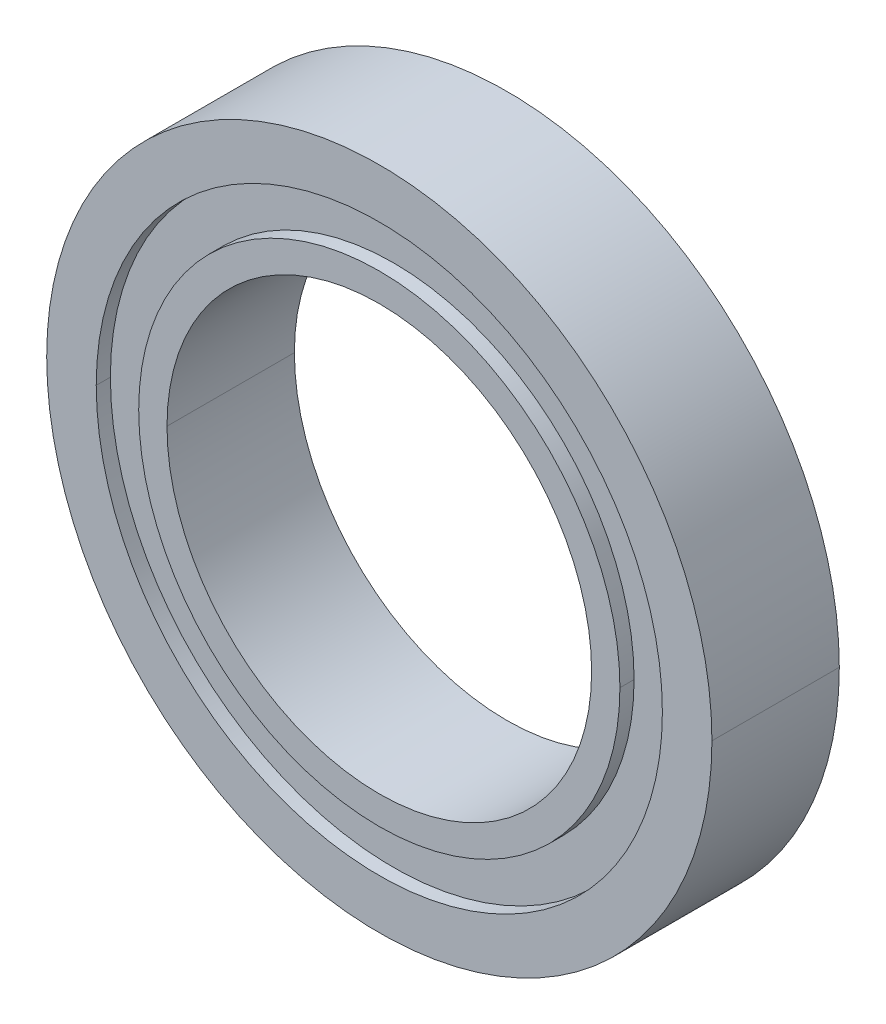
ISO-10303-21;
HEADER;
FILE_DESCRIPTION(('STEP AP214'),'2;1');
FILE_NAME('part.step','',(''),(''),'','','');
FILE_SCHEMA(('AUTOMOTIVE_DESIGN { 1 0 10303 214 1 1 1 1 }'));
ENDSEC;
DATA;
#1=APPLICATION_CONTEXT('core data for automotive mechanical design processes');
#2=APPLICATION_PROTOCOL_DEFINITION('international standard','automotive_design',2000,#1);
#3=PRODUCT_CONTEXT('',#1,'mechanical');
#4=PRODUCT('Part','Part','',(#3));
#5=PRODUCT_RELATED_PRODUCT_CATEGORY('part','',(#4));
#6=PRODUCT_DEFINITION_FORMATION('','',#4);
#7=PRODUCT_DEFINITION_CONTEXT('part definition',#1,'design');
#8=PRODUCT_DEFINITION('design','',#6,#7);
#9=PRODUCT_DEFINITION_SHAPE('','',#8);
#10=(LENGTH_UNIT() NAMED_UNIT(*) SI_UNIT(.MILLI.,.METRE.));
#11=(NAMED_UNIT(*) PLANE_ANGLE_UNIT() SI_UNIT($,.RADIAN.));
#12=(NAMED_UNIT(*) SI_UNIT($,.STERADIAN.) SOLID_ANGLE_UNIT());
#13=UNCERTAINTY_MEASURE_WITH_UNIT(LENGTH_MEASURE(1.E-05),#10,'distance_accuracy_value','');
#14=(GEOMETRIC_REPRESENTATION_CONTEXT(3) GLOBAL_UNCERTAINTY_ASSIGNED_CONTEXT((#13)) GLOBAL_UNIT_ASSIGNED_CONTEXT((#10,
#11,#12)) REPRESENTATION_CONTEXT('',''));
#15=CARTESIAN_POINT('',(0.,0.,0.));
#16=DIRECTION('',(0.,0.,1.));
#17=DIRECTION('',(1.,0.,0.));
#18=AXIS2_PLACEMENT_3D('',#15,#16,#17);
#19=CARTESIAN_POINT('',(0.,0.,8.));
#20=DIRECTION('',(0.,0.,1.));
#21=DIRECTION('',(1.,0.,0.));
#22=AXIS2_PLACEMENT_3D('',#19,#20,#21);
#23=CYLINDRICAL_SURFACE('',#22,17.);
#24=CARTESIAN_POINT('',(0.,0.,8.));
#25=DIRECTION('',(0.,0.,1.));
#26=DIRECTION('',(1.,0.,0.));
#27=AXIS2_PLACEMENT_3D('',#24,#25,#26);
#28=CIRCLE('',#27,17.);
#29=CARTESIAN_POINT('',(17.,0.,8.));
#30=VERTEX_POINT('',#29);
#31=CARTESIAN_POINT('',(-17.,0.,8.));
#32=VERTEX_POINT('',#31);
#33=EDGE_CURVE('E11',#30,#32,#28,.T.);
#34=ORIENTED_EDGE('',*,*,#33,.T.);
#35=DIRECTION('',(0.,0.,1.));
#36=VECTOR('',#35,1.);
#37=CARTESIAN_POINT('',(-17.,0.,8.));
#38=LINE('',#37,#36);
#39=CARTESIAN_POINT('',(-17.,0.,9.));
#40=VERTEX_POINT('',#39);
#41=EDGE_CURVE('E28',#32,#40,#38,.T.);
#42=ORIENTED_EDGE('',*,*,#41,.T.);
#43=CARTESIAN_POINT('',(0.,0.,9.));
#44=DIRECTION('',(0.,0.,1.));
#45=DIRECTION('',(1.,0.,0.));
#46=AXIS2_PLACEMENT_3D('',#43,#44,#45);
#47=CIRCLE('',#46,17.);
#48=CARTESIAN_POINT('',(17.,0.,9.));
#49=VERTEX_POINT('',#48);
#50=EDGE_CURVE('E21',#49,#40,#47,.T.);
#51=ORIENTED_EDGE('',*,*,#50,.F.);
#52=DIRECTION('',(0.,0.,1.));
#53=VECTOR('',#52,1.);
#54=CARTESIAN_POINT('',(17.,0.,8.));
#55=LINE('',#54,#53);
#56=EDGE_CURVE('E132',#30,#49,#55,.T.);
#57=ORIENTED_EDGE('',*,*,#56,.F.);
#58=EDGE_LOOP('',(#34,#42,#51,#57));
#59=FACE_BOUND('',#58,.T.);
#60=ADVANCED_FACE('F17',(#59),#23,.T.);
#61=CARTESIAN_POINT('',(0.,0.,8.));
#62=DIRECTION('',(0.,0.,1.));
#63=DIRECTION('',(1.,0.,0.));
#64=AXIS2_PLACEMENT_3D('',#61,#62,#63);
#65=CYLINDRICAL_SURFACE('',#64,20.);
#66=CARTESIAN_POINT('',(0.,0.,8.));
#67=DIRECTION('',(0.,0.,1.));
#68=DIRECTION('',(1.,0.,0.));
#69=AXIS2_PLACEMENT_3D('',#66,#67,#68);
#70=CIRCLE('',#69,20.);
#71=CARTESIAN_POINT('',(-20.,0.,8.));
#72=VERTEX_POINT('',#71);
#73=CARTESIAN_POINT('',(20.,0.,8.));
#74=VERTEX_POINT('',#73);
#75=EDGE_CURVE('E131',#72,#74,#70,.T.);
#76=ORIENTED_EDGE('',*,*,#75,.F.);
#77=DIRECTION('',(0.,0.,1.));
#78=VECTOR('',#77,1.);
#79=CARTESIAN_POINT('',(-20.,0.,8.));
#80=LINE('',#79,#78);
#81=CARTESIAN_POINT('',(-20.,0.,9.));
#82=VERTEX_POINT('',#81);
#83=EDGE_CURVE('E183',#72,#82,#80,.T.);
#84=ORIENTED_EDGE('',*,*,#83,.T.);
#85=CARTESIAN_POINT('',(0.,0.,9.));
#86=DIRECTION('',(0.,0.,1.));
#87=DIRECTION('',(1.,0.,0.));
#88=AXIS2_PLACEMENT_3D('',#85,#86,#87);
#89=CIRCLE('',#88,20.);
#90=CARTESIAN_POINT('',(20.,0.,9.));
#91=VERTEX_POINT('',#90);
#92=EDGE_CURVE('E110',#82,#91,#89,.T.);
#93=ORIENTED_EDGE('',*,*,#92,.T.);
#94=DIRECTION('',(0.,0.,1.));
#95=VECTOR('',#94,1.);
#96=CARTESIAN_POINT('',(20.,0.,8.));
#97=LINE('',#96,#95);
#98=EDGE_CURVE('E124',#74,#91,#97,.T.);
#99=ORIENTED_EDGE('',*,*,#98,.F.);
#100=EDGE_LOOP('',(#76,#84,#93,#99));
#101=FACE_BOUND('',#100,.T.);
#102=ADVANCED_FACE('F200',(#101),#65,.F.);
#103=CARTESIAN_POINT('',(0.,0.,9.));
#104=DIRECTION('',(0.,0.,-1.));
#105=DIRECTION('',(-1.,0.,0.));
#106=AXIS2_PLACEMENT_3D('',#103,#104,#105);
#107=CYLINDRICAL_SURFACE('',#106,15.);
#108=CARTESIAN_POINT('',(0.,0.,9.));
#109=DIRECTION('',(0.,0.,1.));
#110=DIRECTION('',(1.,0.,0.));
#111=AXIS2_PLACEMENT_3D('',#108,#109,#110);
#112=CIRCLE('',#111,15.);
#113=CARTESIAN_POINT('',(-15.,0.,9.));
#114=VERTEX_POINT('',#113);
#115=CARTESIAN_POINT('',(15.,0.,9.));
#116=VERTEX_POINT('',#115);
#117=EDGE_CURVE('E101',#114,#116,#112,.T.);
#118=ORIENTED_EDGE('',*,*,#117,.T.);
#119=DIRECTION('',(0.,0.,-1.));
#120=VECTOR('',#119,1.);
#121=CARTESIAN_POINT('',(15.,0.,9.));
#122=LINE('',#121,#120);
#123=CARTESIAN_POINT('',(15.,0.,0.));
#124=VERTEX_POINT('',#123);
#125=EDGE_CURVE('E90',#116,#124,#122,.T.);
#126=ORIENTED_EDGE('',*,*,#125,.T.);
#127=CARTESIAN_POINT('',(0.,0.,0.));
#128=DIRECTION('',(0.,0.,1.));
#129=DIRECTION('',(1.,0.,0.));
#130=AXIS2_PLACEMENT_3D('',#127,#128,#129);
#131=CIRCLE('',#130,15.);
#132=CARTESIAN_POINT('',(-15.,0.,0.));
#133=VERTEX_POINT('',#132);
#134=EDGE_CURVE('E144',#133,#124,#131,.T.);
#135=ORIENTED_EDGE('',*,*,#134,.F.);
#136=DIRECTION('',(0.,0.,-1.));
#137=VECTOR('',#136,1.);
#138=CARTESIAN_POINT('',(-15.,0.,9.));
#139=LINE('',#138,#137);
#140=EDGE_CURVE('E107',#114,#133,#139,.T.);
#141=ORIENTED_EDGE('',*,*,#140,.F.);
#142=EDGE_LOOP('',(#118,#126,#135,#141));
#143=FACE_BOUND('',#142,.T.);
#144=ADVANCED_FACE('F106',(#143),#107,.F.);
#145=CARTESIAN_POINT('',(0.,0.,9.));
#146=DIRECTION('',(0.,0.,-1.));
#147=DIRECTION('',(-1.,0.,0.));
#148=AXIS2_PLACEMENT_3D('',#145,#146,#147);
#149=CYLINDRICAL_SURFACE('',#148,23.5);
#150=CARTESIAN_POINT('',(0.,0.,9.));
#151=DIRECTION('',(0.,0.,1.));
#152=DIRECTION('',(1.,0.,0.));
#153=AXIS2_PLACEMENT_3D('',#150,#151,#152);
#154=CIRCLE('',#153,23.5);
#155=CARTESIAN_POINT('',(23.5,0.,9.));
#156=VERTEX_POINT('',#155);
#157=CARTESIAN_POINT('',(-23.5,0.,9.));
#158=VERTEX_POINT('',#157);
#159=EDGE_CURVE('E150',#156,#158,#154,.T.);
#160=ORIENTED_EDGE('',*,*,#159,.F.);
#161=DIRECTION('',(0.,0.,-1.));
#162=VECTOR('',#161,1.);
#163=CARTESIAN_POINT('',(23.5,0.,9.));
#164=LINE('',#163,#162);
#165=CARTESIAN_POINT('',(23.5,0.,0.));
#166=VERTEX_POINT('',#165);
#167=EDGE_CURVE('E102',#156,#166,#164,.T.);
#168=ORIENTED_EDGE('',*,*,#167,.T.);
#169=CARTESIAN_POINT('',(0.,0.,0.));
#170=DIRECTION('',(0.,0.,1.));
#171=DIRECTION('',(1.,0.,0.));
#172=AXIS2_PLACEMENT_3D('',#169,#170,#171);
#173=CIRCLE('',#172,23.5);
#174=CARTESIAN_POINT('',(-23.5,0.,0.));
#175=VERTEX_POINT('',#174);
#176=EDGE_CURVE('E141',#166,#175,#173,.T.);
#177=ORIENTED_EDGE('',*,*,#176,.T.);
#178=DIRECTION('',(0.,0.,-1.));
#179=VECTOR('',#178,1.);
#180=CARTESIAN_POINT('',(-23.5,0.,9.));
#181=LINE('',#180,#179);
#182=EDGE_CURVE('E121',#158,#175,#181,.T.);
#183=ORIENTED_EDGE('',*,*,#182,.F.);
#184=EDGE_LOOP('',(#160,#168,#177,#183));
#185=FACE_BOUND('',#184,.T.);
#186=ADVANCED_FACE('F222',(#185),#149,.T.);
#187=CARTESIAN_POINT('',(0.,0.,9.));
#188=DIRECTION('',(0.,0.,1.));
#189=DIRECTION('',(1.,0.,0.));
#190=AXIS2_PLACEMENT_3D('',#187,#188,#189);
#191=PLANE('',#190);
#192=ORIENTED_EDGE('',*,*,#50,.T.);
#193=CARTESIAN_POINT('',(0.,0.,9.));
#194=DIRECTION('',(0.,0.,1.));
#195=DIRECTION('',(1.,0.,0.));
#196=AXIS2_PLACEMENT_3D('',#193,#194,#195);
#197=CIRCLE('',#196,17.);
#198=EDGE_CURVE('E127',#40,#49,#197,.T.);
#199=ORIENTED_EDGE('',*,*,#198,.T.);
#200=EDGE_LOOP('',(#192,#199));
#201=FACE_BOUND('',#200,.T.);
#202=ORIENTED_EDGE('',*,*,#117,.F.);
#203=CARTESIAN_POINT('',(0.,0.,9.));
#204=DIRECTION('',(0.,0.,1.));
#205=DIRECTION('',(1.,0.,0.));
#206=AXIS2_PLACEMENT_3D('',#203,#204,#205);
#207=CIRCLE('',#206,15.);
#208=EDGE_CURVE('E95',#116,#114,#207,.T.);
#209=ORIENTED_EDGE('',*,*,#208,.F.);
#210=EDGE_LOOP('',(#202,#209));
#211=FACE_BOUND('',#210,.T.);
#212=ADVANCED_FACE('F19',(#201,#211),#191,.T.);
#213=CARTESIAN_POINT('',(0.,0.,9.));
#214=DIRECTION('',(0.,0.,1.));
#215=DIRECTION('',(1.,0.,0.));
#216=AXIS2_PLACEMENT_3D('',#213,#214,#215);
#217=PLANE('',#216);
#218=CARTESIAN_POINT('',(0.,0.,9.));
#219=DIRECTION('',(0.,0.,1.));
#220=DIRECTION('',(1.,0.,0.));
#221=AXIS2_PLACEMENT_3D('',#218,#219,#220);
#222=CIRCLE('',#221,23.5);
#223=EDGE_CURVE('E154',#158,#156,#222,.T.);
#224=ORIENTED_EDGE('',*,*,#223,.T.);
#225=ORIENTED_EDGE('',*,*,#159,.T.);
#226=EDGE_LOOP('',(#224,#225));
#227=FACE_BOUND('',#226,.T.);
#228=CARTESIAN_POINT('',(0.,0.,9.));
#229=DIRECTION('',(0.,0.,1.));
#230=DIRECTION('',(1.,0.,0.));
#231=AXIS2_PLACEMENT_3D('',#228,#229,#230);
#232=CIRCLE('',#231,20.);
#233=EDGE_CURVE('E148',#91,#82,#232,.T.);
#234=ORIENTED_EDGE('',*,*,#233,.F.);
#235=ORIENTED_EDGE('',*,*,#92,.F.);
#236=EDGE_LOOP('',(#234,#235));
#237=FACE_BOUND('',#236,.T.);
#238=ADVANCED_FACE('F210',(#227,#237),#217,.T.);
#239=CARTESIAN_POINT('',(0.,0.,0.));
#240=DIRECTION('',(0.,0.,1.));
#241=DIRECTION('',(1.,0.,0.));
#242=AXIS2_PLACEMENT_3D('',#239,#240,#241);
#243=PLANE('',#242);
#244=CARTESIAN_POINT('',(0.,0.,0.));
#245=DIRECTION('',(0.,0.,1.));
#246=DIRECTION('',(1.,0.,0.));
#247=AXIS2_PLACEMENT_3D('',#244,#245,#246);
#248=CIRCLE('',#247,23.5);
#249=EDGE_CURVE('E113',#175,#166,#248,.T.);
#250=ORIENTED_EDGE('',*,*,#249,.F.);
#251=ORIENTED_EDGE('',*,*,#176,.F.);
#252=EDGE_LOOP('',(#250,#251));
#253=FACE_BOUND('',#252,.T.);
#254=ORIENTED_EDGE('',*,*,#134,.T.);
#255=CARTESIAN_POINT('',(0.,0.,0.));
#256=DIRECTION('',(0.,0.,1.));
#257=DIRECTION('',(1.,0.,0.));
#258=AXIS2_PLACEMENT_3D('',#255,#256,#257);
#259=CIRCLE('',#258,15.);
#260=EDGE_CURVE('E97',#124,#133,#259,.T.);
#261=ORIENTED_EDGE('',*,*,#260,.T.);
#262=EDGE_LOOP('',(#254,#261));
#263=FACE_BOUND('',#262,.T.);
#264=ADVANCED_FACE('F212',(#253,#263),#243,.F.);
#265=CARTESIAN_POINT('',(0.,0.,9.));
#266=DIRECTION('',(0.,0.,-1.));
#267=DIRECTION('',(-1.,0.,0.));
#268=AXIS2_PLACEMENT_3D('',#265,#266,#267);
#269=CYLINDRICAL_SURFACE('',#268,23.5);
#270=ORIENTED_EDGE('',*,*,#167,.F.);
#271=ORIENTED_EDGE('',*,*,#223,.F.);
#272=ORIENTED_EDGE('',*,*,#182,.T.);
#273=ORIENTED_EDGE('',*,*,#249,.T.);
#274=EDGE_LOOP('',(#270,#271,#272,#273));
#275=FACE_BOUND('',#274,.T.);
#276=ADVANCED_FACE('F219',(#275),#269,.T.);
#277=CARTESIAN_POINT('',(0.,0.,9.));
#278=DIRECTION('',(0.,0.,-1.));
#279=DIRECTION('',(-1.,0.,0.));
#280=AXIS2_PLACEMENT_3D('',#277,#278,#279);
#281=CYLINDRICAL_SURFACE('',#280,15.);
#282=ORIENTED_EDGE('',*,*,#125,.F.);
#283=ORIENTED_EDGE('',*,*,#208,.T.);
#284=ORIENTED_EDGE('',*,*,#140,.T.);
#285=ORIENTED_EDGE('',*,*,#260,.F.);
#286=EDGE_LOOP('',(#282,#283,#284,#285));
#287=FACE_BOUND('',#286,.T.);
#288=ADVANCED_FACE('F92',(#287),#281,.F.);
#289=CARTESIAN_POINT('',(0.,0.,8.));
#290=DIRECTION('',(0.,0.,1.));
#291=DIRECTION('',(1.,0.,0.));
#292=AXIS2_PLACEMENT_3D('',#289,#290,#291);
#293=CYLINDRICAL_SURFACE('',#292,20.);
#294=ORIENTED_EDGE('',*,*,#83,.F.);
#295=CARTESIAN_POINT('',(0.,0.,8.));
#296=DIRECTION('',(0.,0.,1.));
#297=DIRECTION('',(1.,0.,0.));
#298=AXIS2_PLACEMENT_3D('',#295,#296,#297);
#299=CIRCLE('',#298,20.);
#300=EDGE_CURVE('E145',#74,#72,#299,.T.);
#301=ORIENTED_EDGE('',*,*,#300,.F.);
#302=ORIENTED_EDGE('',*,*,#98,.T.);
#303=ORIENTED_EDGE('',*,*,#233,.T.);
#304=EDGE_LOOP('',(#294,#301,#302,#303));
#305=FACE_BOUND('',#304,.T.);
#306=ADVANCED_FACE('F208',(#305),#293,.F.);
#307=CARTESIAN_POINT('',(0.,0.,8.));
#308=DIRECTION('',(0.,0.,1.));
#309=DIRECTION('',(1.,0.,0.));
#310=AXIS2_PLACEMENT_3D('',#307,#308,#309);
#311=PLANE('',#310);
#312=ORIENTED_EDGE('',*,*,#300,.T.);
#313=ORIENTED_EDGE('',*,*,#75,.T.);
#314=EDGE_LOOP('',(#312,#313));
#315=FACE_BOUND('',#314,.T.);
#316=ORIENTED_EDGE('',*,*,#33,.F.);
#317=CARTESIAN_POINT('',(0.,0.,8.));
#318=DIRECTION('',(0.,0.,1.));
#319=DIRECTION('',(1.,0.,0.));
#320=AXIS2_PLACEMENT_3D('',#317,#318,#319);
#321=CIRCLE('',#320,17.);
#322=EDGE_CURVE('E129',#32,#30,#321,.T.);
#323=ORIENTED_EDGE('',*,*,#322,.F.);
#324=EDGE_LOOP('',(#316,#323));
#325=FACE_BOUND('',#324,.T.);
#326=ADVANCED_FACE('F236',(#315,#325),#311,.T.);
#327=CARTESIAN_POINT('',(0.,0.,8.));
#328=DIRECTION('',(0.,0.,1.));
#329=DIRECTION('',(1.,0.,0.));
#330=AXIS2_PLACEMENT_3D('',#327,#328,#329);
#331=CYLINDRICAL_SURFACE('',#330,17.);
#332=ORIENTED_EDGE('',*,*,#41,.F.);
#333=ORIENTED_EDGE('',*,*,#322,.T.);
#334=ORIENTED_EDGE('',*,*,#56,.T.);
#335=ORIENTED_EDGE('',*,*,#198,.F.);
#336=EDGE_LOOP('',(#332,#333,#334,#335));
#337=FACE_BOUND('',#336,.T.);
#338=ADVANCED_FACE('F233',(#337),#331,.T.);
#339=CLOSED_SHELL('',(#60,#102,#144,#186,#212,#238,#264,#276,#288,#306,#326,#338));
#340=MANIFOLD_SOLID_BREP('B1',#339);
#341=ADVANCED_BREP_SHAPE_REPRESENTATION('',(#18,#340),#14);
#342=SHAPE_DEFINITION_REPRESENTATION(#9,#341);
ENDSEC;
END-ISO-10303-21;
